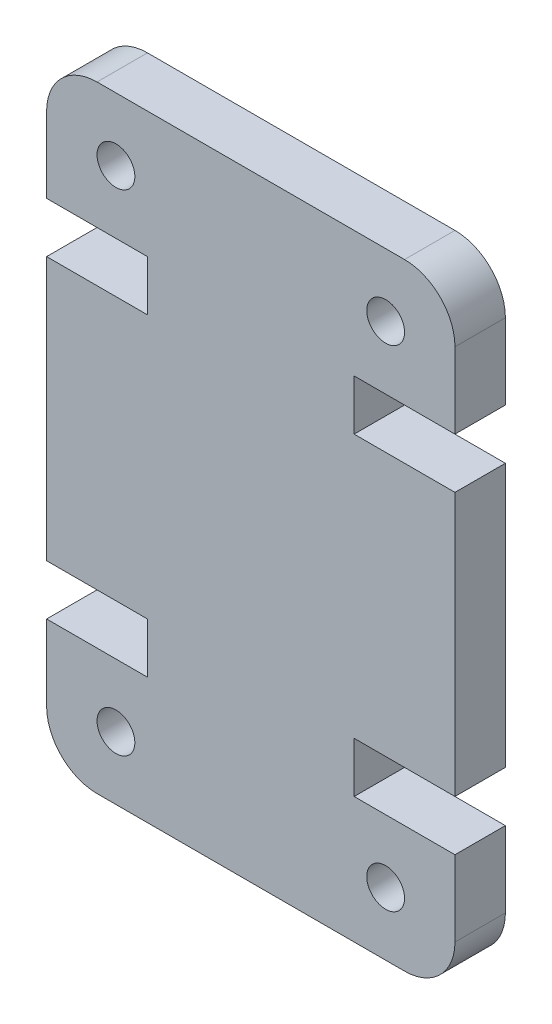
ISO-10303-21;
HEADER;
FILE_DESCRIPTION(('STEP AP214'),'2;1');
FILE_NAME('part.step','',(''),(''),'','','');
FILE_SCHEMA(('AUTOMOTIVE_DESIGN { 1 0 10303 214 1 1 1 1 }'));
ENDSEC;
DATA;
#1=APPLICATION_CONTEXT('core data for automotive mechanical design processes');
#2=APPLICATION_PROTOCOL_DEFINITION('international standard','automotive_design',2000,#1);
#3=PRODUCT_CONTEXT('',#1,'mechanical');
#4=PRODUCT('Part','Part','',(#3));
#5=PRODUCT_RELATED_PRODUCT_CATEGORY('part','',(#4));
#6=PRODUCT_DEFINITION_FORMATION('','',#4);
#7=PRODUCT_DEFINITION_CONTEXT('part definition',#1,'design');
#8=PRODUCT_DEFINITION('design','',#6,#7);
#9=PRODUCT_DEFINITION_SHAPE('','',#8);
#10=(LENGTH_UNIT() NAMED_UNIT(*) SI_UNIT(.MILLI.,.METRE.));
#11=(NAMED_UNIT(*) PLANE_ANGLE_UNIT() SI_UNIT($,.RADIAN.));
#12=(NAMED_UNIT(*) SI_UNIT($,.STERADIAN.) SOLID_ANGLE_UNIT());
#13=UNCERTAINTY_MEASURE_WITH_UNIT(LENGTH_MEASURE(1.E-05),#10,'distance_accuracy_value','');
#14=(GEOMETRIC_REPRESENTATION_CONTEXT(3) GLOBAL_UNCERTAINTY_ASSIGNED_CONTEXT((#13)) GLOBAL_UNIT_ASSIGNED_CONTEXT((#10,
#11,#12)) REPRESENTATION_CONTEXT('',''));
#15=CARTESIAN_POINT('',(0.,0.,0.));
#16=DIRECTION('',(0.,0.,1.));
#17=DIRECTION('',(1.,0.,0.));
#18=AXIS2_PLACEMENT_3D('',#15,#16,#17);
#19=CARTESIAN_POINT('',(14.2,2.,4.));
#20=DIRECTION('',(0.,0.,-1.));
#21=DIRECTION('',(-1.,0.,0.));
#22=AXIS2_PLACEMENT_3D('',#19,#20,#21);
#23=CYLINDRICAL_SURFACE('',#22,2.);
#24=CARTESIAN_POINT('',(14.2,2.,2.));
#25=DIRECTION('',(0.,0.,-1.));
#26=DIRECTION('',(-1.,0.,0.));
#27=AXIS2_PLACEMENT_3D('',#24,#25,#26);
#28=CIRCLE('',#27,2.);
#29=CARTESIAN_POINT('',(16.2,2.00000000000001,2.));
#30=VERTEX_POINT('',#29);
#31=CARTESIAN_POINT('',(14.2,0.,2.));
#32=VERTEX_POINT('',#31);
#33=EDGE_CURVE('E49',#30,#32,#28,.T.);
#34=ORIENTED_EDGE('',*,*,#33,.F.);
#35=DIRECTION('',(0.,0.,-1.));
#36=VECTOR('',#35,1.);
#37=CARTESIAN_POINT('',(16.2,2.,4.));
#38=LINE('',#37,#36);
#39=CARTESIAN_POINT('',(16.2,2.,4.));
#40=VERTEX_POINT('',#39);
#41=EDGE_CURVE('E11',#40,#30,#38,.T.);
#42=ORIENTED_EDGE('',*,*,#41,.F.);
#43=CARTESIAN_POINT('',(14.2,2.,4.));
#44=DIRECTION('',(0.,0.,1.));
#45=DIRECTION('',(-1.,0.,0.));
#46=AXIS2_PLACEMENT_3D('',#43,#44,#45);
#47=CIRCLE('',#46,2.);
#48=CARTESIAN_POINT('',(14.2,0.,4.));
#49=VERTEX_POINT('',#48);
#50=EDGE_CURVE('E354',#49,#40,#47,.T.);
#51=ORIENTED_EDGE('',*,*,#50,.F.);
#52=DIRECTION('',(0.,0.,-1.));
#53=VECTOR('',#52,1.);
#54=CARTESIAN_POINT('',(14.2,0.,4.));
#55=LINE('',#54,#53);
#56=EDGE_CURVE('E215',#49,#32,#55,.T.);
#57=ORIENTED_EDGE('',*,*,#56,.T.);
#58=EDGE_LOOP('',(#34,#42,#51,#57));
#59=FACE_BOUND('',#58,.T.);
#60=ADVANCED_FACE('F34',(#59),#23,.T.);
#61=CARTESIAN_POINT('',(16.2,5.00000000000014,4.));
#62=DIRECTION('',(-1.,0.,0.));
#63=DIRECTION('',(0.,0.,1.));
#64=AXIS2_PLACEMENT_3D('',#61,#62,#63);
#65=PLANE('',#64);
#66=DIRECTION('',(0.,-1.,0.));
#67=VECTOR('',#66,1.);
#68=CARTESIAN_POINT('',(16.2,24.45,2.));
#69=LINE('',#68,#67);
#70=CARTESIAN_POINT('',(16.2,5.00000000000014,2.));
#71=VERTEX_POINT('',#70);
#72=EDGE_CURVE('E291',#71,#30,#69,.T.);
#73=ORIENTED_EDGE('',*,*,#72,.F.);
#74=DIRECTION('',(0.,0.,-1.));
#75=VECTOR('',#74,1.);
#76=CARTESIAN_POINT('',(16.2,5.00000000000014,4.));
#77=LINE('',#76,#75);
#78=CARTESIAN_POINT('',(16.2,5.00000000000014,4.));
#79=VERTEX_POINT('',#78);
#80=EDGE_CURVE('E42',#79,#71,#77,.T.);
#81=ORIENTED_EDGE('',*,*,#80,.F.);
#82=DIRECTION('',(0.,1.,0.));
#83=VECTOR('',#82,1.);
#84=CARTESIAN_POINT('',(16.2,5.00000000000014,4.));
#85=LINE('',#84,#83);
#86=EDGE_CURVE('E290',#40,#79,#85,.T.);
#87=ORIENTED_EDGE('',*,*,#86,.F.);
#88=ORIENTED_EDGE('',*,*,#41,.T.);
#89=EDGE_LOOP('',(#73,#81,#87,#88));
#90=FACE_BOUND('',#89,.T.);
#91=ADVANCED_FACE('F289',(#90),#65,.F.);
#92=CARTESIAN_POINT('',(12.2,5.00000000000014,4.));
#93=DIRECTION('',(0.,-1.,0.));
#94=DIRECTION('',(0.,0.,-1.));
#95=AXIS2_PLACEMENT_3D('',#92,#93,#94);
#96=PLANE('',#95);
#97=DIRECTION('',(1.,0.,0.));
#98=VECTOR('',#97,1.);
#99=CARTESIAN_POINT('',(12.2,5.00000000000014,2.));
#100=LINE('',#99,#98);
#101=CARTESIAN_POINT('',(12.2,5.00000000000014,2.));
#102=VERTEX_POINT('',#101);
#103=EDGE_CURVE('E285',#102,#71,#100,.T.);
#104=ORIENTED_EDGE('',*,*,#103,.F.);
#105=DIRECTION('',(0.,0.,-1.));
#106=VECTOR('',#105,1.);
#107=CARTESIAN_POINT('',(12.2,5.00000000000014,4.));
#108=LINE('',#107,#106);
#109=CARTESIAN_POINT('',(12.2,5.00000000000014,4.));
#110=VERTEX_POINT('',#109);
#111=EDGE_CURVE('E275',#110,#102,#108,.T.);
#112=ORIENTED_EDGE('',*,*,#111,.F.);
#113=DIRECTION('',(-1.,0.,0.));
#114=VECTOR('',#113,1.);
#115=CARTESIAN_POINT('',(12.2,5.00000000000014,4.));
#116=LINE('',#115,#114);
#117=EDGE_CURVE('E286',#79,#110,#116,.T.);
#118=ORIENTED_EDGE('',*,*,#117,.F.);
#119=ORIENTED_EDGE('',*,*,#80,.T.);
#120=EDGE_LOOP('',(#104,#112,#118,#119));
#121=FACE_BOUND('',#120,.T.);
#122=ADVANCED_FACE('F283',(#121),#96,.F.);
#123=CARTESIAN_POINT('',(12.2,7.00000000000014,4.));
#124=DIRECTION('',(-1.,0.,0.));
#125=DIRECTION('',(0.,0.,1.));
#126=AXIS2_PLACEMENT_3D('',#123,#124,#125);
#127=PLANE('',#126);
#128=DIRECTION('',(0.,-1.,0.));
#129=VECTOR('',#128,1.);
#130=CARTESIAN_POINT('',(12.2,7.00000000000014,2.));
#131=LINE('',#130,#129);
#132=CARTESIAN_POINT('',(12.2,7.00000000000014,2.));
#133=VERTEX_POINT('',#132);
#134=EDGE_CURVE('E338',#133,#102,#131,.T.);
#135=ORIENTED_EDGE('',*,*,#134,.F.);
#136=DIRECTION('',(0.,0.,-1.));
#137=VECTOR('',#136,1.);
#138=CARTESIAN_POINT('',(12.2,7.00000000000014,4.));
#139=LINE('',#138,#137);
#140=CARTESIAN_POINT('',(12.2,7.00000000000014,4.));
#141=VERTEX_POINT('',#140);
#142=EDGE_CURVE('E272',#141,#133,#139,.T.);
#143=ORIENTED_EDGE('',*,*,#142,.F.);
#144=DIRECTION('',(0.,1.,0.));
#145=VECTOR('',#144,1.);
#146=CARTESIAN_POINT('',(12.2,7.00000000000014,4.));
#147=LINE('',#146,#145);
#148=EDGE_CURVE('E358',#110,#141,#147,.T.);
#149=ORIENTED_EDGE('',*,*,#148,.F.);
#150=ORIENTED_EDGE('',*,*,#111,.T.);
#151=EDGE_LOOP('',(#135,#143,#149,#150));
#152=FACE_BOUND('',#151,.T.);
#153=ADVANCED_FACE('F461',(#152),#127,.F.);
#154=CARTESIAN_POINT('',(16.2,7.00000000000014,4.));
#155=DIRECTION('',(0.,1.,0.));
#156=DIRECTION('',(-1.,0.,0.));
#157=AXIS2_PLACEMENT_3D('',#154,#155,#156);
#158=PLANE('',#157);
#159=DIRECTION('',(-1.,0.,0.));
#160=VECTOR('',#159,1.);
#161=CARTESIAN_POINT('',(16.2,7.00000000000014,2.));
#162=LINE('',#161,#160);
#163=CARTESIAN_POINT('',(16.2,7.00000000000014,2.));
#164=VERTEX_POINT('',#163);
#165=EDGE_CURVE('E336',#164,#133,#162,.T.);
#166=ORIENTED_EDGE('',*,*,#165,.F.);
#167=DIRECTION('',(0.,0.,-1.));
#168=VECTOR('',#167,1.);
#169=CARTESIAN_POINT('',(16.2,7.00000000000014,4.));
#170=LINE('',#169,#168);
#171=CARTESIAN_POINT('',(16.2,7.00000000000014,4.));
#172=VERTEX_POINT('',#171);
#173=EDGE_CURVE('E269',#172,#164,#170,.T.);
#174=ORIENTED_EDGE('',*,*,#173,.F.);
#175=DIRECTION('',(1.,0.,0.));
#176=VECTOR('',#175,1.);
#177=CARTESIAN_POINT('',(16.2,7.00000000000014,4.));
#178=LINE('',#177,#176);
#179=EDGE_CURVE('E360',#141,#172,#178,.T.);
#180=ORIENTED_EDGE('',*,*,#179,.F.);
#181=ORIENTED_EDGE('',*,*,#142,.T.);
#182=EDGE_LOOP('',(#166,#174,#180,#181));
#183=FACE_BOUND('',#182,.T.);
#184=ADVANCED_FACE('F457',(#183),#158,.F.);
#185=CARTESIAN_POINT('',(16.2,17.4499999999999,4.));
#186=DIRECTION('',(-1.,0.,0.));
#187=DIRECTION('',(0.,0.,1.));
#188=AXIS2_PLACEMENT_3D('',#185,#186,#187);
#189=PLANE('',#188);
#190=CARTESIAN_POINT('',(16.2,17.4499999999999,2.));
#191=VERTEX_POINT('',#190);
#192=EDGE_CURVE('E293',#191,#164,#69,.T.);
#193=ORIENTED_EDGE('',*,*,#192,.F.);
#194=DIRECTION('',(0.,0.,-1.));
#195=VECTOR('',#194,1.);
#196=CARTESIAN_POINT('',(16.2,17.4499999999999,4.));
#197=LINE('',#196,#195);
#198=CARTESIAN_POINT('',(16.2,17.4499999999999,4.));
#199=VERTEX_POINT('',#198);
#200=EDGE_CURVE('E266',#199,#191,#197,.T.);
#201=ORIENTED_EDGE('',*,*,#200,.F.);
#202=DIRECTION('',(0.,1.,0.));
#203=VECTOR('',#202,1.);
#204=CARTESIAN_POINT('',(16.2,17.4499999999999,4.));
#205=LINE('',#204,#203);
#206=EDGE_CURVE('E362',#172,#199,#205,.T.);
#207=ORIENTED_EDGE('',*,*,#206,.F.);
#208=ORIENTED_EDGE('',*,*,#173,.T.);
#209=EDGE_LOOP('',(#193,#201,#207,#208));
#210=FACE_BOUND('',#209,.T.);
#211=ADVANCED_FACE('F452',(#210),#189,.F.);
#212=CARTESIAN_POINT('',(16.2,17.4499999999999,4.));
#213=DIRECTION('',(0.,-1.,0.));
#214=DIRECTION('',(1.,0.,0.));
#215=AXIS2_PLACEMENT_3D('',#212,#213,#214);
#216=PLANE('',#215);
#217=DIRECTION('',(1.,0.,0.));
#218=VECTOR('',#217,1.);
#219=CARTESIAN_POINT('',(16.2,17.4499999999999,2.));
#220=LINE('',#219,#218);
#221=CARTESIAN_POINT('',(12.2,17.4499999999999,2.));
#222=VERTEX_POINT('',#221);
#223=EDGE_CURVE('E334',#222,#191,#220,.T.);
#224=ORIENTED_EDGE('',*,*,#223,.F.);
#225=DIRECTION('',(0.,0.,-1.));
#226=VECTOR('',#225,1.);
#227=CARTESIAN_POINT('',(12.2,17.4499999999999,4.));
#228=LINE('',#227,#226);
#229=CARTESIAN_POINT('',(12.2,17.4499999999999,4.));
#230=VERTEX_POINT('',#229);
#231=EDGE_CURVE('E263',#230,#222,#228,.T.);
#232=ORIENTED_EDGE('',*,*,#231,.F.);
#233=DIRECTION('',(-1.,0.,0.));
#234=VECTOR('',#233,1.);
#235=CARTESIAN_POINT('',(16.2,17.4499999999999,4.));
#236=LINE('',#235,#234);
#237=EDGE_CURVE('E364',#199,#230,#236,.T.);
#238=ORIENTED_EDGE('',*,*,#237,.F.);
#239=ORIENTED_EDGE('',*,*,#200,.T.);
#240=EDGE_LOOP('',(#224,#232,#238,#239));
#241=FACE_BOUND('',#240,.T.);
#242=ADVANCED_FACE('F447',(#241),#216,.F.);
#243=CARTESIAN_POINT('',(12.2,17.4499999999999,4.));
#244=DIRECTION('',(-1.,0.,0.));
#245=DIRECTION('',(0.,0.,1.));
#246=AXIS2_PLACEMENT_3D('',#243,#244,#245);
#247=PLANE('',#246);
#248=DIRECTION('',(0.,-1.,0.));
#249=VECTOR('',#248,1.);
#250=CARTESIAN_POINT('',(12.2,17.4499999999999,2.));
#251=LINE('',#250,#249);
#252=CARTESIAN_POINT('',(12.2,19.4499999999999,2.));
#253=VERTEX_POINT('',#252);
#254=EDGE_CURVE('E332',#253,#222,#251,.T.);
#255=ORIENTED_EDGE('',*,*,#254,.F.);
#256=DIRECTION('',(0.,0.,-1.));
#257=VECTOR('',#256,1.);
#258=CARTESIAN_POINT('',(12.2,19.4499999999999,4.));
#259=LINE('',#258,#257);
#260=CARTESIAN_POINT('',(12.2,19.4499999999999,4.));
#261=VERTEX_POINT('',#260);
#262=EDGE_CURVE('E260',#261,#253,#259,.T.);
#263=ORIENTED_EDGE('',*,*,#262,.F.);
#264=DIRECTION('',(0.,1.,0.));
#265=VECTOR('',#264,1.);
#266=CARTESIAN_POINT('',(12.2,17.4499999999999,4.));
#267=LINE('',#266,#265);
#268=EDGE_CURVE('E366',#230,#261,#267,.T.);
#269=ORIENTED_EDGE('',*,*,#268,.F.);
#270=ORIENTED_EDGE('',*,*,#231,.T.);
#271=EDGE_LOOP('',(#255,#263,#269,#270));
#272=FACE_BOUND('',#271,.T.);
#273=ADVANCED_FACE('F442',(#272),#247,.F.);
#274=CARTESIAN_POINT('',(12.2,19.4499999999999,4.));
#275=DIRECTION('',(0.,1.,0.));
#276=DIRECTION('',(0.,0.,1.));
#277=AXIS2_PLACEMENT_3D('',#274,#275,#276);
#278=PLANE('',#277);
#279=DIRECTION('',(-1.,0.,0.));
#280=VECTOR('',#279,1.);
#281=CARTESIAN_POINT('',(12.2,19.4499999999999,2.));
#282=LINE('',#281,#280);
#283=CARTESIAN_POINT('',(16.2,19.4499999999999,2.));
#284=VERTEX_POINT('',#283);
#285=EDGE_CURVE('E330',#284,#253,#282,.T.);
#286=ORIENTED_EDGE('',*,*,#285,.F.);
#287=DIRECTION('',(0.,0.,-1.));
#288=VECTOR('',#287,1.);
#289=CARTESIAN_POINT('',(16.2,19.4499999999999,4.));
#290=LINE('',#289,#288);
#291=CARTESIAN_POINT('',(16.2,19.4499999999999,4.));
#292=VERTEX_POINT('',#291);
#293=EDGE_CURVE('E257',#292,#284,#290,.T.);
#294=ORIENTED_EDGE('',*,*,#293,.F.);
#295=DIRECTION('',(1.,0.,0.));
#296=VECTOR('',#295,1.);
#297=CARTESIAN_POINT('',(12.2,19.4499999999999,4.));
#298=LINE('',#297,#296);
#299=EDGE_CURVE('E368',#261,#292,#298,.T.);
#300=ORIENTED_EDGE('',*,*,#299,.F.);
#301=ORIENTED_EDGE('',*,*,#262,.T.);
#302=EDGE_LOOP('',(#286,#294,#300,#301));
#303=FACE_BOUND('',#302,.T.);
#304=ADVANCED_FACE('F437',(#303),#278,.F.);
#305=CARTESIAN_POINT('',(16.2,19.4499999999999,4.));
#306=DIRECTION('',(-1.,0.,0.));
#307=DIRECTION('',(0.,0.,1.));
#308=AXIS2_PLACEMENT_3D('',#305,#306,#307);
#309=PLANE('',#308);
#310=CARTESIAN_POINT('',(16.2,22.45,2.));
#311=VERTEX_POINT('',#310);
#312=EDGE_CURVE('E296',#311,#284,#69,.T.);
#313=ORIENTED_EDGE('',*,*,#312,.F.);
#314=DIRECTION('',(0.,0.,-1.));
#315=VECTOR('',#314,1.);
#316=CARTESIAN_POINT('',(16.2,22.45,4.));
#317=LINE('',#316,#315);
#318=CARTESIAN_POINT('',(16.2,22.45,4.));
#319=VERTEX_POINT('',#318);
#320=EDGE_CURVE('E254',#319,#311,#317,.T.);
#321=ORIENTED_EDGE('',*,*,#320,.F.);
#322=DIRECTION('',(0.,1.,0.));
#323=VECTOR('',#322,1.);
#324=CARTESIAN_POINT('',(16.2,19.4499999999999,4.));
#325=LINE('',#324,#323);
#326=EDGE_CURVE('E370',#292,#319,#325,.T.);
#327=ORIENTED_EDGE('',*,*,#326,.F.);
#328=ORIENTED_EDGE('',*,*,#293,.T.);
#329=EDGE_LOOP('',(#313,#321,#327,#328));
#330=FACE_BOUND('',#329,.T.);
#331=ADVANCED_FACE('F433',(#330),#309,.F.);
#332=CARTESIAN_POINT('',(14.2,22.45,4.));
#333=DIRECTION('',(0.,0.,-1.));
#334=DIRECTION('',(-1.,0.,0.));
#335=AXIS2_PLACEMENT_3D('',#332,#333,#334);
#336=CYLINDRICAL_SURFACE('',#335,2.);
#337=CARTESIAN_POINT('',(14.2,22.45,2.));
#338=DIRECTION('',(0.,0.,-1.));
#339=DIRECTION('',(-1.,0.,0.));
#340=AXIS2_PLACEMENT_3D('',#337,#338,#339);
#341=CIRCLE('',#340,2.);
#342=CARTESIAN_POINT('',(14.2,24.45,2.));
#343=VERTEX_POINT('',#342);
#344=EDGE_CURVE('E328',#343,#311,#341,.T.);
#345=ORIENTED_EDGE('',*,*,#344,.F.);
#346=DIRECTION('',(0.,0.,-1.));
#347=VECTOR('',#346,1.);
#348=CARTESIAN_POINT('',(14.2,24.45,4.));
#349=LINE('',#348,#347);
#350=CARTESIAN_POINT('',(14.2,24.45,4.));
#351=VERTEX_POINT('',#350);
#352=EDGE_CURVE('E251',#351,#343,#349,.T.);
#353=ORIENTED_EDGE('',*,*,#352,.F.);
#354=CARTESIAN_POINT('',(14.2,22.45,4.));
#355=DIRECTION('',(0.,0.,1.));
#356=DIRECTION('',(1.,0.,0.));
#357=AXIS2_PLACEMENT_3D('',#354,#355,#356);
#358=CIRCLE('',#357,2.);
#359=EDGE_CURVE('E372',#319,#351,#358,.T.);
#360=ORIENTED_EDGE('',*,*,#359,.F.);
#361=ORIENTED_EDGE('',*,*,#320,.T.);
#362=EDGE_LOOP('',(#345,#353,#360,#361));
#363=FACE_BOUND('',#362,.T.);
#364=ADVANCED_FACE('F429',(#363),#336,.T.);
#365=CARTESIAN_POINT('',(1.99999999999999,24.45,4.));
#366=DIRECTION('',(0.,-1.,0.));
#367=DIRECTION('',(0.,0.,-1.));
#368=AXIS2_PLACEMENT_3D('',#365,#366,#367);
#369=PLANE('',#368);
#370=DIRECTION('',(1.,0.,0.));
#371=VECTOR('',#370,1.);
#372=CARTESIAN_POINT('',(0.,24.45,2.));
#373=LINE('',#372,#371);
#374=CARTESIAN_POINT('',(2.,24.45,2.));
#375=VERTEX_POINT('',#374);
#376=EDGE_CURVE('E294',#375,#343,#373,.T.);
#377=ORIENTED_EDGE('',*,*,#376,.F.);
#378=DIRECTION('',(0.,0.,-1.));
#379=VECTOR('',#378,1.);
#380=CARTESIAN_POINT('',(1.99999999999999,24.45,4.));
#381=LINE('',#380,#379);
#382=CARTESIAN_POINT('',(1.99999999999999,24.45,4.));
#383=VERTEX_POINT('',#382);
#384=EDGE_CURVE('E248',#383,#375,#381,.T.);
#385=ORIENTED_EDGE('',*,*,#384,.F.);
#386=DIRECTION('',(-1.,0.,0.));
#387=VECTOR('',#386,1.);
#388=CARTESIAN_POINT('',(1.99999999999999,24.45,4.));
#389=LINE('',#388,#387);
#390=EDGE_CURVE('E374',#351,#383,#389,.T.);
#391=ORIENTED_EDGE('',*,*,#390,.F.);
#392=ORIENTED_EDGE('',*,*,#352,.T.);
#393=EDGE_LOOP('',(#377,#385,#391,#392));
#394=FACE_BOUND('',#393,.T.);
#395=ADVANCED_FACE('F426',(#394),#369,.F.);
#396=CARTESIAN_POINT('',(2.,22.45,4.));
#397=DIRECTION('',(0.,0.,-1.));
#398=DIRECTION('',(-1.,0.,0.));
#399=AXIS2_PLACEMENT_3D('',#396,#397,#398);
#400=CYLINDRICAL_SURFACE('',#399,2.);
#401=CARTESIAN_POINT('',(2.,22.45,2.));
#402=DIRECTION('',(0.,0.,-1.));
#403=DIRECTION('',(-1.,0.,0.));
#404=AXIS2_PLACEMENT_3D('',#401,#402,#403);
#405=CIRCLE('',#404,2.);
#406=CARTESIAN_POINT('',(0.,22.45,2.));
#407=VERTEX_POINT('',#406);
#408=EDGE_CURVE('E326',#407,#375,#405,.T.);
#409=ORIENTED_EDGE('',*,*,#408,.F.);
#410=DIRECTION('',(0.,0.,-1.));
#411=VECTOR('',#410,1.);
#412=CARTESIAN_POINT('',(0.,22.45,4.));
#413=LINE('',#412,#411);
#414=CARTESIAN_POINT('',(0.,22.45,4.));
#415=VERTEX_POINT('',#414);
#416=EDGE_CURVE('E245',#415,#407,#413,.T.);
#417=ORIENTED_EDGE('',*,*,#416,.F.);
#418=CARTESIAN_POINT('',(2.,22.45,4.));
#419=DIRECTION('',(0.,0.,1.));
#420=DIRECTION('',(-1.,0.,0.));
#421=AXIS2_PLACEMENT_3D('',#418,#419,#420);
#422=CIRCLE('',#421,2.);
#423=EDGE_CURVE('E376',#383,#415,#422,.T.);
#424=ORIENTED_EDGE('',*,*,#423,.F.);
#425=ORIENTED_EDGE('',*,*,#384,.T.);
#426=EDGE_LOOP('',(#409,#417,#424,#425));
#427=FACE_BOUND('',#426,.T.);
#428=ADVANCED_FACE('F415',(#427),#400,.T.);
#429=CARTESIAN_POINT('',(0.,19.4499999999999,4.));
#430=DIRECTION('',(1.,0.,0.));
#431=DIRECTION('',(0.,1.,0.));
#432=AXIS2_PLACEMENT_3D('',#429,#430,#431);
#433=PLANE('',#432);
#434=DIRECTION('',(0.,1.,0.));
#435=VECTOR('',#434,1.);
#436=CARTESIAN_POINT('',(0.,0.,2.));
#437=LINE('',#436,#435);
#438=CARTESIAN_POINT('',(0.,19.4499999999999,2.));
#439=VERTEX_POINT('',#438);
#440=EDGE_CURVE('E201',#439,#407,#437,.T.);
#441=ORIENTED_EDGE('',*,*,#440,.F.);
#442=DIRECTION('',(0.,0.,-1.));
#443=VECTOR('',#442,1.);
#444=CARTESIAN_POINT('',(0.,19.4499999999999,4.));
#445=LINE('',#444,#443);
#446=CARTESIAN_POINT('',(0.,19.4499999999999,4.));
#447=VERTEX_POINT('',#446);
#448=EDGE_CURVE('E242',#447,#439,#445,.T.);
#449=ORIENTED_EDGE('',*,*,#448,.F.);
#450=DIRECTION('',(0.,-1.,0.));
#451=VECTOR('',#450,1.);
#452=CARTESIAN_POINT('',(0.,19.4499999999999,4.));
#453=LINE('',#452,#451);
#454=EDGE_CURVE('E378',#415,#447,#453,.T.);
#455=ORIENTED_EDGE('',*,*,#454,.F.);
#456=ORIENTED_EDGE('',*,*,#416,.T.);
#457=EDGE_LOOP('',(#441,#449,#455,#456));
#458=FACE_BOUND('',#457,.T.);
#459=ADVANCED_FACE('F419',(#458),#433,.F.);
#460=CARTESIAN_POINT('',(3.99999999999999,19.4499999999999,4.));
#461=DIRECTION('',(0.,1.,0.));
#462=DIRECTION('',(-1.,0.,0.));
#463=AXIS2_PLACEMENT_3D('',#460,#461,#462);
#464=PLANE('',#463);
#465=DIRECTION('',(-1.,0.,0.));
#466=VECTOR('',#465,1.);
#467=CARTESIAN_POINT('',(3.99999999999999,19.4499999999999,2.));
#468=LINE('',#467,#466);
#469=CARTESIAN_POINT('',(3.99999999999999,19.4499999999999,2.));
#470=VERTEX_POINT('',#469);
#471=EDGE_CURVE('E324',#470,#439,#468,.T.);
#472=ORIENTED_EDGE('',*,*,#471,.F.);
#473=DIRECTION('',(0.,0.,-1.));
#474=VECTOR('',#473,1.);
#475=CARTESIAN_POINT('',(3.99999999999999,19.4499999999999,4.));
#476=LINE('',#475,#474);
#477=CARTESIAN_POINT('',(3.99999999999999,19.4499999999999,4.));
#478=VERTEX_POINT('',#477);
#479=EDGE_CURVE('E239',#478,#470,#476,.T.);
#480=ORIENTED_EDGE('',*,*,#479,.F.);
#481=DIRECTION('',(1.,0.,0.));
#482=VECTOR('',#481,1.);
#483=CARTESIAN_POINT('',(3.99999999999999,19.4499999999999,4.));
#484=LINE('',#483,#482);
#485=EDGE_CURVE('E380',#447,#478,#484,.T.);
#486=ORIENTED_EDGE('',*,*,#485,.F.);
#487=ORIENTED_EDGE('',*,*,#448,.T.);
#488=EDGE_LOOP('',(#472,#480,#486,#487));
#489=FACE_BOUND('',#488,.T.);
#490=ADVANCED_FACE('F496',(#489),#464,.F.);
#491=CARTESIAN_POINT('',(3.99999999999999,17.4499999999999,4.));
#492=DIRECTION('',(1.,0.,0.));
#493=DIRECTION('',(0.,0.,-1.));
#494=AXIS2_PLACEMENT_3D('',#491,#492,#493);
#495=PLANE('',#494);
#496=DIRECTION('',(0.,1.,0.));
#497=VECTOR('',#496,1.);
#498=CARTESIAN_POINT('',(3.99999999999999,17.4499999999999,2.));
#499=LINE('',#498,#497);
#500=CARTESIAN_POINT('',(3.99999999999999,17.4499999999999,2.));
#501=VERTEX_POINT('',#500);
#502=EDGE_CURVE('E322',#501,#470,#499,.T.);
#503=ORIENTED_EDGE('',*,*,#502,.F.);
#504=DIRECTION('',(0.,0.,-1.));
#505=VECTOR('',#504,1.);
#506=CARTESIAN_POINT('',(3.99999999999999,17.4499999999999,4.));
#507=LINE('',#506,#505);
#508=CARTESIAN_POINT('',(3.99999999999999,17.4499999999999,4.));
#509=VERTEX_POINT('',#508);
#510=EDGE_CURVE('E236',#509,#501,#507,.T.);
#511=ORIENTED_EDGE('',*,*,#510,.F.);
#512=DIRECTION('',(0.,-1.,0.));
#513=VECTOR('',#512,1.);
#514=CARTESIAN_POINT('',(3.99999999999999,17.4499999999999,4.));
#515=LINE('',#514,#513);
#516=EDGE_CURVE('E382',#478,#509,#515,.T.);
#517=ORIENTED_EDGE('',*,*,#516,.F.);
#518=ORIENTED_EDGE('',*,*,#479,.T.);
#519=EDGE_LOOP('',(#503,#511,#517,#518));
#520=FACE_BOUND('',#519,.T.);
#521=ADVANCED_FACE('F499',(#520),#495,.F.);
#522=CARTESIAN_POINT('',(0.,17.4499999999999,4.));
#523=DIRECTION('',(0.,-1.,0.));
#524=DIRECTION('',(1.,0.,0.));
#525=AXIS2_PLACEMENT_3D('',#522,#523,#524);
#526=PLANE('',#525);
#527=DIRECTION('',(1.,0.,0.));
#528=VECTOR('',#527,1.);
#529=CARTESIAN_POINT('',(0.,17.4499999999999,2.));
#530=LINE('',#529,#528);
#531=CARTESIAN_POINT('',(0.,17.4499999999999,2.));
#532=VERTEX_POINT('',#531);
#533=EDGE_CURVE('E320',#532,#501,#530,.T.);
#534=ORIENTED_EDGE('',*,*,#533,.F.);
#535=DIRECTION('',(0.,0.,-1.));
#536=VECTOR('',#535,1.);
#537=CARTESIAN_POINT('',(0.,17.4499999999999,4.));
#538=LINE('',#537,#536);
#539=CARTESIAN_POINT('',(0.,17.4499999999999,4.));
#540=VERTEX_POINT('',#539);
#541=EDGE_CURVE('E233',#540,#532,#538,.T.);
#542=ORIENTED_EDGE('',*,*,#541,.F.);
#543=DIRECTION('',(-1.,0.,0.));
#544=VECTOR('',#543,1.);
#545=CARTESIAN_POINT('',(0.,17.4499999999999,4.));
#546=LINE('',#545,#544);
#547=EDGE_CURVE('E384',#509,#540,#546,.T.);
#548=ORIENTED_EDGE('',*,*,#547,.F.);
#549=ORIENTED_EDGE('',*,*,#510,.T.);
#550=EDGE_LOOP('',(#534,#542,#548,#549));
#551=FACE_BOUND('',#550,.T.);
#552=ADVANCED_FACE('F503',(#551),#526,.F.);
#553=CARTESIAN_POINT('',(0.,17.4499999999999,4.));
#554=DIRECTION('',(1.,0.,0.));
#555=DIRECTION('',(0.,0.,-1.));
#556=AXIS2_PLACEMENT_3D('',#553,#554,#555);
#557=PLANE('',#556);
#558=CARTESIAN_POINT('',(0.,7.00000000000013,2.));
#559=VERTEX_POINT('',#558);
#560=EDGE_CURVE('E405',#559,#532,#437,.T.);
#561=ORIENTED_EDGE('',*,*,#560,.F.);
#562=DIRECTION('',(0.,0.,-1.));
#563=VECTOR('',#562,1.);
#564=CARTESIAN_POINT('',(0.,7.00000000000012,4.));
#565=LINE('',#564,#563);
#566=CARTESIAN_POINT('',(0.,7.00000000000012,4.));
#567=VERTEX_POINT('',#566);
#568=EDGE_CURVE('E230',#567,#559,#565,.T.);
#569=ORIENTED_EDGE('',*,*,#568,.F.);
#570=DIRECTION('',(0.,-1.,0.));
#571=VECTOR('',#570,1.);
#572=CARTESIAN_POINT('',(0.,17.4499999999999,4.));
#573=LINE('',#572,#571);
#574=EDGE_CURVE('E386',#540,#567,#573,.T.);
#575=ORIENTED_EDGE('',*,*,#574,.F.);
#576=ORIENTED_EDGE('',*,*,#541,.T.);
#577=EDGE_LOOP('',(#561,#569,#575,#576));
#578=FACE_BOUND('',#577,.T.);
#579=ADVANCED_FACE('F507',(#578),#557,.F.);
#580=CARTESIAN_POINT('',(0.,7.00000000000012,4.));
#581=DIRECTION('',(0.,1.,0.));
#582=DIRECTION('',(-1.,0.,0.));
#583=AXIS2_PLACEMENT_3D('',#580,#581,#582);
#584=PLANE('',#583);
#585=DIRECTION('',(-1.,0.,0.));
#586=VECTOR('',#585,1.);
#587=CARTESIAN_POINT('',(0.,7.00000000000012,2.));
#588=LINE('',#587,#586);
#589=CARTESIAN_POINT('',(4.,7.00000000000014,2.));
#590=VERTEX_POINT('',#589);
#591=EDGE_CURVE('E318',#590,#559,#588,.T.);
#592=ORIENTED_EDGE('',*,*,#591,.F.);
#593=DIRECTION('',(0.,0.,-1.));
#594=VECTOR('',#593,1.);
#595=CARTESIAN_POINT('',(4.,7.00000000000014,4.));
#596=LINE('',#595,#594);
#597=CARTESIAN_POINT('',(4.,7.00000000000014,4.));
#598=VERTEX_POINT('',#597);
#599=EDGE_CURVE('E227',#598,#590,#596,.T.);
#600=ORIENTED_EDGE('',*,*,#599,.F.);
#601=DIRECTION('',(1.,0.,0.));
#602=VECTOR('',#601,1.);
#603=CARTESIAN_POINT('',(0.,7.00000000000012,4.));
#604=LINE('',#603,#602);
#605=EDGE_CURVE('E388',#567,#598,#604,.T.);
#606=ORIENTED_EDGE('',*,*,#605,.F.);
#607=ORIENTED_EDGE('',*,*,#568,.T.);
#608=EDGE_LOOP('',(#592,#600,#606,#607));
#609=FACE_BOUND('',#608,.T.);
#610=ADVANCED_FACE('F511',(#609),#584,.F.);
#611=CARTESIAN_POINT('',(4.,7.00000000000014,4.));
#612=DIRECTION('',(1.,0.,0.));
#613=DIRECTION('',(0.,0.,-1.));
#614=AXIS2_PLACEMENT_3D('',#611,#612,#613);
#615=PLANE('',#614);
#616=DIRECTION('',(0.,1.,0.));
#617=VECTOR('',#616,1.);
#618=CARTESIAN_POINT('',(4.,7.00000000000014,2.));
#619=LINE('',#618,#617);
#620=CARTESIAN_POINT('',(4.,5.00000000000014,2.));
#621=VERTEX_POINT('',#620);
#622=EDGE_CURVE('E316',#621,#590,#619,.T.);
#623=ORIENTED_EDGE('',*,*,#622,.F.);
#624=DIRECTION('',(0.,0.,-1.));
#625=VECTOR('',#624,1.);
#626=CARTESIAN_POINT('',(4.,5.00000000000014,4.));
#627=LINE('',#626,#625);
#628=CARTESIAN_POINT('',(4.,5.00000000000014,4.));
#629=VERTEX_POINT('',#628);
#630=EDGE_CURVE('E224',#629,#621,#627,.T.);
#631=ORIENTED_EDGE('',*,*,#630,.F.);
#632=DIRECTION('',(0.,-1.,0.));
#633=VECTOR('',#632,1.);
#634=CARTESIAN_POINT('',(4.,7.00000000000014,4.));
#635=LINE('',#634,#633);
#636=EDGE_CURVE('E390',#598,#629,#635,.T.);
#637=ORIENTED_EDGE('',*,*,#636,.F.);
#638=ORIENTED_EDGE('',*,*,#599,.T.);
#639=EDGE_LOOP('',(#623,#631,#637,#638));
#640=FACE_BOUND('',#639,.T.);
#641=ADVANCED_FACE('F515',(#640),#615,.F.);
#642=CARTESIAN_POINT('',(4.,5.00000000000014,4.));
#643=DIRECTION('',(0.,-1.,0.));
#644=DIRECTION('',(1.,0.,0.));
#645=AXIS2_PLACEMENT_3D('',#642,#643,#644);
#646=PLANE('',#645);
#647=DIRECTION('',(1.,0.,0.));
#648=VECTOR('',#647,1.);
#649=CARTESIAN_POINT('',(4.,5.00000000000014,2.));
#650=LINE('',#649,#648);
#651=CARTESIAN_POINT('',(0.,5.00000000000014,2.));
#652=VERTEX_POINT('',#651);
#653=EDGE_CURVE('E211',#652,#621,#650,.T.);
#654=ORIENTED_EDGE('',*,*,#653,.F.);
#655=DIRECTION('',(0.,0.,-1.));
#656=VECTOR('',#655,1.);
#657=CARTESIAN_POINT('',(0.,5.00000000000014,4.));
#658=LINE('',#657,#656);
#659=CARTESIAN_POINT('',(0.,5.00000000000014,4.));
#660=VERTEX_POINT('',#659);
#661=EDGE_CURVE('E217',#660,#652,#658,.T.);
#662=ORIENTED_EDGE('',*,*,#661,.F.);
#663=DIRECTION('',(-1.,0.,0.));
#664=VECTOR('',#663,1.);
#665=CARTESIAN_POINT('',(4.,5.00000000000014,4.));
#666=LINE('',#665,#664);
#667=EDGE_CURVE('E392',#629,#660,#666,.T.);
#668=ORIENTED_EDGE('',*,*,#667,.F.);
#669=ORIENTED_EDGE('',*,*,#630,.T.);
#670=EDGE_LOOP('',(#654,#662,#668,#669));
#671=FACE_BOUND('',#670,.T.);
#672=ADVANCED_FACE('F519',(#671),#646,.F.);
#673=CARTESIAN_POINT('',(0.,5.00000000000014,4.));
#674=DIRECTION('',(1.,0.,0.));
#675=DIRECTION('',(0.,0.,-1.));
#676=AXIS2_PLACEMENT_3D('',#673,#674,#675);
#677=PLANE('',#676);
#678=CARTESIAN_POINT('',(0.,2.,2.));
#679=VERTEX_POINT('',#678);
#680=EDGE_CURVE('E297',#679,#652,#437,.T.);
#681=ORIENTED_EDGE('',*,*,#680,.F.);
#682=DIRECTION('',(0.,0.,-1.));
#683=VECTOR('',#682,1.);
#684=CARTESIAN_POINT('',(0.,2.00000000000002,4.));
#685=LINE('',#684,#683);
#686=CARTESIAN_POINT('',(0.,2.00000000000002,4.));
#687=VERTEX_POINT('',#686);
#688=EDGE_CURVE('E210',#687,#679,#685,.T.);
#689=ORIENTED_EDGE('',*,*,#688,.F.);
#690=DIRECTION('',(0.,-1.,0.));
#691=VECTOR('',#690,1.);
#692=CARTESIAN_POINT('',(0.,5.00000000000014,4.));
#693=LINE('',#692,#691);
#694=EDGE_CURVE('E394',#660,#687,#693,.T.);
#695=ORIENTED_EDGE('',*,*,#694,.F.);
#696=ORIENTED_EDGE('',*,*,#661,.T.);
#697=EDGE_LOOP('',(#681,#689,#695,#696));
#698=FACE_BOUND('',#697,.T.);
#699=ADVANCED_FACE('F403',(#698),#677,.F.);
#700=CARTESIAN_POINT('',(2.,2.,4.));
#701=DIRECTION('',(0.,0.,-1.));
#702=DIRECTION('',(-1.,0.,0.));
#703=AXIS2_PLACEMENT_3D('',#700,#701,#702);
#704=CYLINDRICAL_SURFACE('',#703,2.);
#705=CARTESIAN_POINT('',(2.,2.,2.));
#706=DIRECTION('',(0.,0.,-1.));
#707=DIRECTION('',(-1.,0.,0.));
#708=AXIS2_PLACEMENT_3D('',#705,#706,#707);
#709=CIRCLE('',#708,2.);
#710=CARTESIAN_POINT('',(2.,0.,2.));
#711=VERTEX_POINT('',#710);
#712=EDGE_CURVE('E196',#711,#679,#709,.T.);
#713=ORIENTED_EDGE('',*,*,#712,.F.);
#714=DIRECTION('',(0.,0.,-1.));
#715=VECTOR('',#714,1.);
#716=CARTESIAN_POINT('',(2.,0.,4.));
#717=LINE('',#716,#715);
#718=CARTESIAN_POINT('',(2.,0.,4.));
#719=VERTEX_POINT('',#718);
#720=EDGE_CURVE('E208',#719,#711,#717,.T.);
#721=ORIENTED_EDGE('',*,*,#720,.F.);
#722=CARTESIAN_POINT('',(2.,2.,4.));
#723=DIRECTION('',(0.,0.,1.));
#724=DIRECTION('',(1.,0.,0.));
#725=AXIS2_PLACEMENT_3D('',#722,#723,#724);
#726=CIRCLE('',#725,2.);
#727=EDGE_CURVE('E396',#687,#719,#726,.T.);
#728=ORIENTED_EDGE('',*,*,#727,.F.);
#729=ORIENTED_EDGE('',*,*,#688,.T.);
#730=EDGE_LOOP('',(#713,#721,#728,#729));
#731=FACE_BOUND('',#730,.T.);
#732=ADVANCED_FACE('F206',(#731),#704,.T.);
#733=CARTESIAN_POINT('',(2.,0.,4.));
#734=DIRECTION('',(0.,1.,0.));
#735=DIRECTION('',(-1.,0.,0.));
#736=AXIS2_PLACEMENT_3D('',#733,#734,#735);
#737=PLANE('',#736);
#738=DIRECTION('',(-1.,0.,0.));
#739=VECTOR('',#738,1.);
#740=CARTESIAN_POINT('',(16.2,0.,2.));
#741=LINE('',#740,#739);
#742=EDGE_CURVE('E193',#32,#711,#741,.T.);
#743=ORIENTED_EDGE('',*,*,#742,.F.);
#744=ORIENTED_EDGE('',*,*,#56,.F.);
#745=DIRECTION('',(1.,0.,0.));
#746=VECTOR('',#745,1.);
#747=CARTESIAN_POINT('',(2.,0.,4.));
#748=LINE('',#747,#746);
#749=EDGE_CURVE('E57',#719,#49,#748,.T.);
#750=ORIENTED_EDGE('',*,*,#749,.F.);
#751=ORIENTED_EDGE('',*,*,#720,.T.);
#752=EDGE_LOOP('',(#743,#744,#750,#751));
#753=FACE_BOUND('',#752,.T.);
#754=ADVANCED_FACE('F214',(#753),#737,.F.);
#755=CARTESIAN_POINT('',(13.4500000000019,2.4999999999999,4.));
#756=DIRECTION('',(0.,0.,-1.));
#757=DIRECTION('',(-1.,0.,0.));
#758=AXIS2_PLACEMENT_3D('',#755,#756,#757);
#759=CYLINDRICAL_SURFACE('',#758,0.750000000000029);
#760=CARTESIAN_POINT('',(13.4500000000019,2.4999999999999,4.));
#761=DIRECTION('',(0.,0.,1.));
#762=DIRECTION('',(-1.,0.,0.));
#763=AXIS2_PLACEMENT_3D('',#760,#761,#762);
#764=CIRCLE('',#763,0.750000000000029);
#765=CARTESIAN_POINT('',(12.7000000000019,2.4999999999999,4.));
#766=VERTEX_POINT('',#765);
#767=EDGE_CURVE('E351',#766,#766,#764,.T.);
#768=ORIENTED_EDGE('',*,*,#767,.T.);
#769=EDGE_LOOP('',(#768));
#770=FACE_BOUND('',#769,.T.);
#771=CARTESIAN_POINT('',(13.4500000000019,2.4999999999999,2.));
#772=DIRECTION('',(0.,0.,-1.));
#773=DIRECTION('',(-1.,0.,0.));
#774=AXIS2_PLACEMENT_3D('',#771,#772,#773);
#775=CIRCLE('',#774,0.750000000000029);
#776=CARTESIAN_POINT('',(12.7000000000019,2.4999999999999,2.));
#777=VERTEX_POINT('',#776);
#778=EDGE_CURVE('E212',#777,#777,#775,.T.);
#779=ORIENTED_EDGE('',*,*,#778,.T.);
#780=EDGE_LOOP('',(#779));
#781=FACE_BOUND('',#780,.T.);
#782=ADVANCED_FACE('F530',(#770,#781),#759,.F.);
#783=CARTESIAN_POINT('',(2.74999999999805,2.4999999999999,4.));
#784=DIRECTION('',(0.,0.,-1.));
#785=DIRECTION('',(-1.,0.,0.));
#786=AXIS2_PLACEMENT_3D('',#783,#784,#785);
#787=CYLINDRICAL_SURFACE('',#786,0.750000000000028);
#788=CARTESIAN_POINT('',(2.74999999999805,2.4999999999999,4.));
#789=DIRECTION('',(0.,0.,1.));
#790=DIRECTION('',(1.,0.,0.));
#791=AXIS2_PLACEMENT_3D('',#788,#789,#790);
#792=CIRCLE('',#791,0.750000000000028);
#793=CARTESIAN_POINT('',(3.49999999999808,2.4999999999999,4.));
#794=VERTEX_POINT('',#793);
#795=EDGE_CURVE('E348',#794,#794,#792,.T.);
#796=ORIENTED_EDGE('',*,*,#795,.T.);
#797=EDGE_LOOP('',(#796));
#798=FACE_BOUND('',#797,.T.);
#799=CARTESIAN_POINT('',(2.74999999999805,2.4999999999999,2.));
#800=DIRECTION('',(0.,0.,-1.));
#801=DIRECTION('',(-1.,0.,0.));
#802=AXIS2_PLACEMENT_3D('',#799,#800,#801);
#803=CIRCLE('',#802,0.750000000000028);
#804=CARTESIAN_POINT('',(1.99999999999802,2.4999999999999,2.));
#805=VERTEX_POINT('',#804);
#806=EDGE_CURVE('E307',#805,#805,#803,.T.);
#807=ORIENTED_EDGE('',*,*,#806,.T.);
#808=EDGE_LOOP('',(#807));
#809=FACE_BOUND('',#808,.T.);
#810=ADVANCED_FACE('F537',(#798,#809),#787,.F.);
#811=CARTESIAN_POINT('',(2.74999999999805,21.9500000000001,4.));
#812=DIRECTION('',(0.,0.,-1.));
#813=DIRECTION('',(-1.,0.,0.));
#814=AXIS2_PLACEMENT_3D('',#811,#812,#813);
#815=CYLINDRICAL_SURFACE('',#814,0.750000000000028);
#816=CARTESIAN_POINT('',(2.74999999999805,21.9500000000001,4.));
#817=DIRECTION('',(0.,0.,1.));
#818=DIRECTION('',(-1.,0.,0.));
#819=AXIS2_PLACEMENT_3D('',#816,#817,#818);
#820=CIRCLE('',#819,0.750000000000028);
#821=CARTESIAN_POINT('',(1.99999999999802,21.9500000000001,4.));
#822=VERTEX_POINT('',#821);
#823=EDGE_CURVE('E345',#822,#822,#820,.T.);
#824=ORIENTED_EDGE('',*,*,#823,.T.);
#825=EDGE_LOOP('',(#824));
#826=FACE_BOUND('',#825,.T.);
#827=CARTESIAN_POINT('',(2.74999999999805,21.9500000000001,2.));
#828=DIRECTION('',(0.,0.,-1.));
#829=DIRECTION('',(-1.,0.,0.));
#830=AXIS2_PLACEMENT_3D('',#827,#828,#829);
#831=CIRCLE('',#830,0.750000000000028);
#832=CARTESIAN_POINT('',(1.99999999999802,21.9500000000001,2.));
#833=VERTEX_POINT('',#832);
#834=EDGE_CURVE('E303',#833,#833,#831,.T.);
#835=ORIENTED_EDGE('',*,*,#834,.T.);
#836=EDGE_LOOP('',(#835));
#837=FACE_BOUND('',#836,.T.);
#838=ADVANCED_FACE('F541',(#826,#837),#815,.F.);
#839=CARTESIAN_POINT('',(13.4500000000019,21.9500000000001,4.));
#840=DIRECTION('',(0.,0.,-1.));
#841=DIRECTION('',(-1.,0.,0.));
#842=AXIS2_PLACEMENT_3D('',#839,#840,#841);
#843=CYLINDRICAL_SURFACE('',#842,0.750000000000024);
#844=CARTESIAN_POINT('',(13.4500000000019,21.9500000000001,4.));
#845=DIRECTION('',(0.,0.,1.));
#846=DIRECTION('',(1.,0.,0.));
#847=AXIS2_PLACEMENT_3D('',#844,#845,#846);
#848=CIRCLE('',#847,0.750000000000024);
#849=CARTESIAN_POINT('',(14.200000000002,21.9500000000001,4.));
#850=VERTEX_POINT('',#849);
#851=EDGE_CURVE('E342',#850,#850,#848,.T.);
#852=ORIENTED_EDGE('',*,*,#851,.T.);
#853=EDGE_LOOP('',(#852));
#854=FACE_BOUND('',#853,.T.);
#855=CARTESIAN_POINT('',(13.4500000000019,21.9500000000001,2.));
#856=DIRECTION('',(0.,0.,-1.));
#857=DIRECTION('',(-1.,0.,0.));
#858=AXIS2_PLACEMENT_3D('',#855,#856,#857);
#859=CIRCLE('',#858,0.750000000000024);
#860=CARTESIAN_POINT('',(12.7000000000019,21.9500000000001,2.));
#861=VERTEX_POINT('',#860);
#862=EDGE_CURVE('E37',#861,#861,#859,.T.);
#863=ORIENTED_EDGE('',*,*,#862,.T.);
#864=EDGE_LOOP('',(#863));
#865=FACE_BOUND('',#864,.T.);
#866=ADVANCED_FACE('F533',(#854,#865),#843,.F.);
#867=CARTESIAN_POINT('',(14.2,2.,4.));
#868=DIRECTION('',(0.,0.,-1.));
#869=DIRECTION('',(-1.,0.,0.));
#870=AXIS2_PLACEMENT_3D('',#867,#868,#869);
#871=PLANE('',#870);
#872=ORIENTED_EDGE('',*,*,#823,.F.);
#873=EDGE_LOOP('',(#872));
#874=FACE_BOUND('',#873,.T.);
#875=ORIENTED_EDGE('',*,*,#767,.F.);
#876=EDGE_LOOP('',(#875));
#877=FACE_BOUND('',#876,.T.);
#878=ORIENTED_EDGE('',*,*,#50,.T.);
#879=ORIENTED_EDGE('',*,*,#86,.T.);
#880=ORIENTED_EDGE('',*,*,#117,.T.);
#881=ORIENTED_EDGE('',*,*,#148,.T.);
#882=ORIENTED_EDGE('',*,*,#179,.T.);
#883=ORIENTED_EDGE('',*,*,#206,.T.);
#884=ORIENTED_EDGE('',*,*,#237,.T.);
#885=ORIENTED_EDGE('',*,*,#268,.T.);
#886=ORIENTED_EDGE('',*,*,#299,.T.);
#887=ORIENTED_EDGE('',*,*,#326,.T.);
#888=ORIENTED_EDGE('',*,*,#359,.T.);
#889=ORIENTED_EDGE('',*,*,#390,.T.);
#890=ORIENTED_EDGE('',*,*,#423,.T.);
#891=ORIENTED_EDGE('',*,*,#454,.T.);
#892=ORIENTED_EDGE('',*,*,#485,.T.);
#893=ORIENTED_EDGE('',*,*,#516,.T.);
#894=ORIENTED_EDGE('',*,*,#547,.T.);
#895=ORIENTED_EDGE('',*,*,#574,.T.);
#896=ORIENTED_EDGE('',*,*,#605,.T.);
#897=ORIENTED_EDGE('',*,*,#636,.T.);
#898=ORIENTED_EDGE('',*,*,#667,.T.);
#899=ORIENTED_EDGE('',*,*,#694,.T.);
#900=ORIENTED_EDGE('',*,*,#727,.T.);
#901=ORIENTED_EDGE('',*,*,#749,.T.);
#902=EDGE_LOOP('',(#878,#879,#880,#881,#882,#883,#884,#885,#886,#887,#888,#889,#890,#891,#892,
#893,#894,#895,#896,#897,#898,#899,#900,#901));
#903=FACE_BOUND('',#902,.T.);
#904=ORIENTED_EDGE('',*,*,#795,.F.);
#905=EDGE_LOOP('',(#904));
#906=FACE_BOUND('',#905,.T.);
#907=ORIENTED_EDGE('',*,*,#851,.F.);
#908=EDGE_LOOP('',(#907));
#909=FACE_BOUND('',#908,.T.);
#910=ADVANCED_FACE('F397',(#874,#877,#903,#906,#909),#871,.F.);
#911=CARTESIAN_POINT('',(0.,0.,2.));
#912=DIRECTION('',(0.,0.,-1.));
#913=DIRECTION('',(-1.,0.,0.));
#914=AXIS2_PLACEMENT_3D('',#911,#912,#913);
#915=PLANE('',#914);
#916=ORIENTED_EDGE('',*,*,#778,.F.);
#917=EDGE_LOOP('',(#916));
#918=FACE_BOUND('',#917,.T.);
#919=ORIENTED_EDGE('',*,*,#806,.F.);
#920=EDGE_LOOP('',(#919));
#921=FACE_BOUND('',#920,.T.);
#922=ORIENTED_EDGE('',*,*,#834,.F.);
#923=EDGE_LOOP('',(#922));
#924=FACE_BOUND('',#923,.T.);
#925=ORIENTED_EDGE('',*,*,#862,.F.);
#926=EDGE_LOOP('',(#925));
#927=FACE_BOUND('',#926,.T.);
#928=ORIENTED_EDGE('',*,*,#33,.T.);
#929=ORIENTED_EDGE('',*,*,#742,.T.);
#930=ORIENTED_EDGE('',*,*,#712,.T.);
#931=ORIENTED_EDGE('',*,*,#680,.T.);
#932=ORIENTED_EDGE('',*,*,#653,.T.);
#933=ORIENTED_EDGE('',*,*,#622,.T.);
#934=ORIENTED_EDGE('',*,*,#591,.T.);
#935=ORIENTED_EDGE('',*,*,#560,.T.);
#936=ORIENTED_EDGE('',*,*,#533,.T.);
#937=ORIENTED_EDGE('',*,*,#502,.T.);
#938=ORIENTED_EDGE('',*,*,#471,.T.);
#939=ORIENTED_EDGE('',*,*,#440,.T.);
#940=ORIENTED_EDGE('',*,*,#408,.T.);
#941=ORIENTED_EDGE('',*,*,#376,.T.);
#942=ORIENTED_EDGE('',*,*,#344,.T.);
#943=ORIENTED_EDGE('',*,*,#312,.T.);
#944=ORIENTED_EDGE('',*,*,#285,.T.);
#945=ORIENTED_EDGE('',*,*,#254,.T.);
#946=ORIENTED_EDGE('',*,*,#223,.T.);
#947=ORIENTED_EDGE('',*,*,#192,.T.);
#948=ORIENTED_EDGE('',*,*,#165,.T.);
#949=ORIENTED_EDGE('',*,*,#134,.T.);
#950=ORIENTED_EDGE('',*,*,#103,.T.);
#951=ORIENTED_EDGE('',*,*,#72,.T.);
#952=EDGE_LOOP('',(#928,#929,#930,#931,#932,#933,#934,#935,#936,#937,#938,#939,#940,#941,#942,
#943,#944,#945,#946,#947,#948,#949,#950,#951));
#953=FACE_BOUND('',#952,.T.);
#954=ADVANCED_FACE('F195',(#918,#921,#924,#927,#953),#915,.T.);
#955=CLOSED_SHELL('',(#60,#91,#122,#153,#184,#211,#242,#273,#304,#331,#364,#395,#428,#459,#490,
#521,#552,#579,#610,#641,#672,#699,#732,#754,#782,#810,#838,#866,#910,#954));
#956=MANIFOLD_SOLID_BREP('B2',#955);
#957=ADVANCED_BREP_SHAPE_REPRESENTATION('',(#18,#956),#14);
#958=SHAPE_DEFINITION_REPRESENTATION(#9,#957);
ENDSEC;
END-ISO-10303-21;
